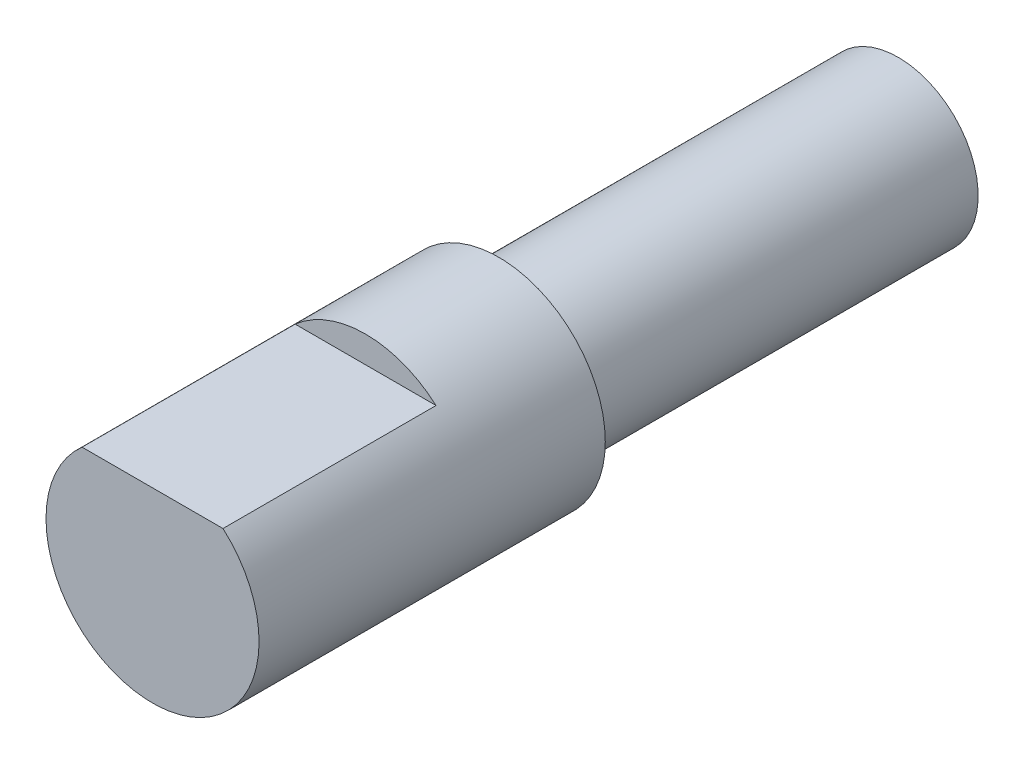
ISO-10303-21;
HEADER;
FILE_DESCRIPTION(('STEP AP214'),'2;1');
FILE_NAME('part.step','',(''),(''),'','','');
FILE_SCHEMA(('AUTOMOTIVE_DESIGN { 1 0 10303 214 1 1 1 1 }'));
ENDSEC;
DATA;
#1=APPLICATION_CONTEXT('core data for automotive mechanical design processes');
#2=APPLICATION_PROTOCOL_DEFINITION('international standard','automotive_design',2000,#1);
#3=PRODUCT_CONTEXT('',#1,'mechanical');
#4=PRODUCT('Part','Part','',(#3));
#5=PRODUCT_RELATED_PRODUCT_CATEGORY('part','',(#4));
#6=PRODUCT_DEFINITION_FORMATION('','',#4);
#7=PRODUCT_DEFINITION_CONTEXT('part definition',#1,'design');
#8=PRODUCT_DEFINITION('design','',#6,#7);
#9=PRODUCT_DEFINITION_SHAPE('','',#8);
#10=(LENGTH_UNIT() NAMED_UNIT(*) SI_UNIT(.MILLI.,.METRE.));
#11=(NAMED_UNIT(*) PLANE_ANGLE_UNIT() SI_UNIT($,.RADIAN.));
#12=(NAMED_UNIT(*) SI_UNIT($,.STERADIAN.) SOLID_ANGLE_UNIT());
#13=UNCERTAINTY_MEASURE_WITH_UNIT(LENGTH_MEASURE(1.E-05),#10,'distance_accuracy_value','');
#14=(GEOMETRIC_REPRESENTATION_CONTEXT(3) GLOBAL_UNCERTAINTY_ASSIGNED_CONTEXT((#13)) GLOBAL_UNIT_ASSIGNED_CONTEXT((#10,
#11,#12)) REPRESENTATION_CONTEXT('',''));
#15=CARTESIAN_POINT('',(0.,0.,0.));
#16=DIRECTION('',(0.,0.,1.));
#17=DIRECTION('',(1.,0.,0.));
#18=AXIS2_PLACEMENT_3D('',#15,#16,#17);
#19=CARTESIAN_POINT('',(0.,0.,28.));
#20=DIRECTION('',(0.,0.,-1.));
#21=DIRECTION('',(-1.,0.,0.));
#22=AXIS2_PLACEMENT_3D('',#19,#20,#21);
#23=CYLINDRICAL_SURFACE('',#22,4.);
#24=CARTESIAN_POINT('',(0.,0.,28.));
#25=DIRECTION('',(0.,0.,1.));
#26=DIRECTION('',(1.,0.,0.));
#27=AXIS2_PLACEMENT_3D('',#24,#25,#26);
#28=CIRCLE('',#27,4.);
#29=CARTESIAN_POINT('',(-2.64575131106459,3.,28.));
#30=VERTEX_POINT('',#29);
#31=CARTESIAN_POINT('',(2.64575131106459,3.,28.));
#32=VERTEX_POINT('',#31);
#33=EDGE_CURVE('E64',#30,#32,#28,.T.);
#34=ORIENTED_EDGE('',*,*,#33,.F.);
#35=DIRECTION('',(0.,0.,-1.));
#36=VECTOR('',#35,1.);
#37=CARTESIAN_POINT('',(-2.64575131106459,3.,28.));
#38=LINE('',#37,#36);
#39=CARTESIAN_POINT('',(-2.64575131106459,3.,20.));
#40=VERTEX_POINT('',#39);
#41=EDGE_CURVE('E46',#30,#40,#38,.T.);
#42=ORIENTED_EDGE('',*,*,#41,.T.);
#43=CARTESIAN_POINT('',(0.,0.,20.));
#44=DIRECTION('',(0.,0.,1.));
#45=DIRECTION('',(1.,0.,0.));
#46=AXIS2_PLACEMENT_3D('',#43,#44,#45);
#47=CIRCLE('',#46,4.);
#48=CARTESIAN_POINT('',(2.64575131106459,3.,20.));
#49=VERTEX_POINT('',#48);
#50=EDGE_CURVE('E11',#49,#40,#47,.T.);
#51=ORIENTED_EDGE('',*,*,#50,.F.);
#52=DIRECTION('',(0.,0.,-1.));
#53=VECTOR('',#52,1.);
#54=CARTESIAN_POINT('',(2.64575131106459,3.,28.));
#55=LINE('',#54,#53);
#56=EDGE_CURVE('E51',#49,#32,#55,.F.);
#57=ORIENTED_EDGE('',*,*,#56,.T.);
#58=EDGE_LOOP('',(#34,#42,#51,#57));
#59=FACE_BOUND('',#58,.T.);
#60=CARTESIAN_POINT('',(0.,0.,15.));
#61=DIRECTION('',(0.,0.,-1.));
#62=DIRECTION('',(-1.,0.,0.));
#63=AXIS2_PLACEMENT_3D('',#60,#61,#62);
#64=CIRCLE('',#63,4.);
#65=CARTESIAN_POINT('',(-4.,0.,15.));
#66=VERTEX_POINT('',#65);
#67=EDGE_CURVE('E60',#66,#66,#64,.T.);
#68=ORIENTED_EDGE('',*,*,#67,.F.);
#69=EDGE_LOOP('',(#68));
#70=FACE_BOUND('',#69,.T.);
#71=ADVANCED_FACE('F32',(#59,#70),#23,.T.);
#72=CARTESIAN_POINT('',(0.,0.,28.));
#73=DIRECTION('',(0.,0.,1.));
#74=DIRECTION('',(1.,0.,0.));
#75=AXIS2_PLACEMENT_3D('',#72,#73,#74);
#76=PLANE('',#75);
#77=DIRECTION('',(1.,0.,0.));
#78=VECTOR('',#77,1.);
#79=CARTESIAN_POINT('',(0.,3.,28.));
#80=LINE('',#79,#78);
#81=EDGE_CURVE('E39',#30,#32,#80,.T.);
#82=ORIENTED_EDGE('',*,*,#81,.F.);
#83=ORIENTED_EDGE('',*,*,#33,.T.);
#84=EDGE_LOOP('',(#82,#83));
#85=FACE_BOUND('',#84,.T.);
#86=ADVANCED_FACE('F67',(#85),#76,.T.);
#87=CARTESIAN_POINT('',(0.,0.,15.));
#88=DIRECTION('',(0.,0.,-1.));
#89=DIRECTION('',(-1.,0.,0.));
#90=AXIS2_PLACEMENT_3D('',#87,#88,#89);
#91=PLANE('',#90);
#92=CARTESIAN_POINT('',(0.,0.,15.));
#93=DIRECTION('',(0.,0.,-1.));
#94=DIRECTION('',(-1.,0.,0.));
#95=AXIS2_PLACEMENT_3D('',#92,#93,#94);
#96=CIRCLE('',#95,3.);
#97=CARTESIAN_POINT('',(-3.,0.,15.));
#98=VERTEX_POINT('',#97);
#99=EDGE_CURVE('E75',#98,#98,#96,.T.);
#100=ORIENTED_EDGE('',*,*,#99,.F.);
#101=EDGE_LOOP('',(#100));
#102=FACE_BOUND('',#101,.T.);
#103=ORIENTED_EDGE('',*,*,#67,.T.);
#104=EDGE_LOOP('',(#103));
#105=FACE_BOUND('',#104,.T.);
#106=ADVANCED_FACE('F89',(#102,#105),#91,.T.);
#107=CARTESIAN_POINT('',(0.,0.,20.));
#108=DIRECTION('',(0.,0.,1.));
#109=DIRECTION('',(1.,0.,0.));
#110=AXIS2_PLACEMENT_3D('',#107,#108,#109);
#111=PLANE('',#110);
#112=ORIENTED_EDGE('',*,*,#50,.T.);
#113=DIRECTION('',(1.,0.,0.));
#114=VECTOR('',#113,1.);
#115=CARTESIAN_POINT('',(-4.13732059255832,3.,20.));
#116=LINE('',#115,#114);
#117=EDGE_CURVE('E65',#40,#49,#116,.T.);
#118=ORIENTED_EDGE('',*,*,#117,.T.);
#119=EDGE_LOOP('',(#112,#118));
#120=FACE_BOUND('',#119,.T.);
#121=ADVANCED_FACE('F92',(#120),#111,.T.);
#122=CARTESIAN_POINT('',(-4.13732059255832,3.,20.));
#123=DIRECTION('',(0.,-1.,0.));
#124=DIRECTION('',(0.,0.,-1.));
#125=AXIS2_PLACEMENT_3D('',#122,#123,#124);
#126=PLANE('',#125);
#127=ORIENTED_EDGE('',*,*,#81,.T.);
#128=ORIENTED_EDGE('',*,*,#56,.F.);
#129=ORIENTED_EDGE('',*,*,#117,.F.);
#130=ORIENTED_EDGE('',*,*,#41,.F.);
#131=EDGE_LOOP('',(#127,#128,#129,#130));
#132=FACE_BOUND('',#131,.T.);
#133=ADVANCED_FACE('F56',(#132),#126,.F.);
#134=CARTESIAN_POINT('',(0.,0.,0.));
#135=DIRECTION('',(0.,0.,1.));
#136=DIRECTION('',(1.,0.,0.));
#137=AXIS2_PLACEMENT_3D('',#134,#135,#136);
#138=CYLINDRICAL_SURFACE('',#137,3.);
#139=CARTESIAN_POINT('',(0.,0.,0.));
#140=DIRECTION('',(0.,0.,-1.));
#141=DIRECTION('',(-1.,0.,0.));
#142=AXIS2_PLACEMENT_3D('',#139,#140,#141);
#143=CIRCLE('',#142,3.);
#144=CARTESIAN_POINT('',(-3.,0.,0.));
#145=VERTEX_POINT('',#144);
#146=EDGE_CURVE('E74',#145,#145,#143,.T.);
#147=ORIENTED_EDGE('',*,*,#146,.F.);
#148=EDGE_LOOP('',(#147));
#149=FACE_BOUND('',#148,.T.);
#150=ORIENTED_EDGE('',*,*,#99,.T.);
#151=EDGE_LOOP('',(#150));
#152=FACE_BOUND('',#151,.T.);
#153=ADVANCED_FACE('F83',(#149,#152),#138,.T.);
#154=CARTESIAN_POINT('',(0.,0.,0.));
#155=DIRECTION('',(0.,0.,-1.));
#156=DIRECTION('',(-1.,0.,0.));
#157=AXIS2_PLACEMENT_3D('',#154,#155,#156);
#158=PLANE('',#157);
#159=ORIENTED_EDGE('',*,*,#146,.T.);
#160=EDGE_LOOP('',(#159));
#161=FACE_BOUND('',#160,.T.);
#162=ADVANCED_FACE('F81',(#161),#158,.T.);
#163=CLOSED_SHELL('',(#71,#86,#106,#121,#133,#153,#162));
#164=MANIFOLD_SOLID_BREP('B2',#163);
#165=ADVANCED_BREP_SHAPE_REPRESENTATION('',(#18,#164),#14);
#166=SHAPE_DEFINITION_REPRESENTATION(#9,#165);
ENDSEC;
END-ISO-10303-21;
